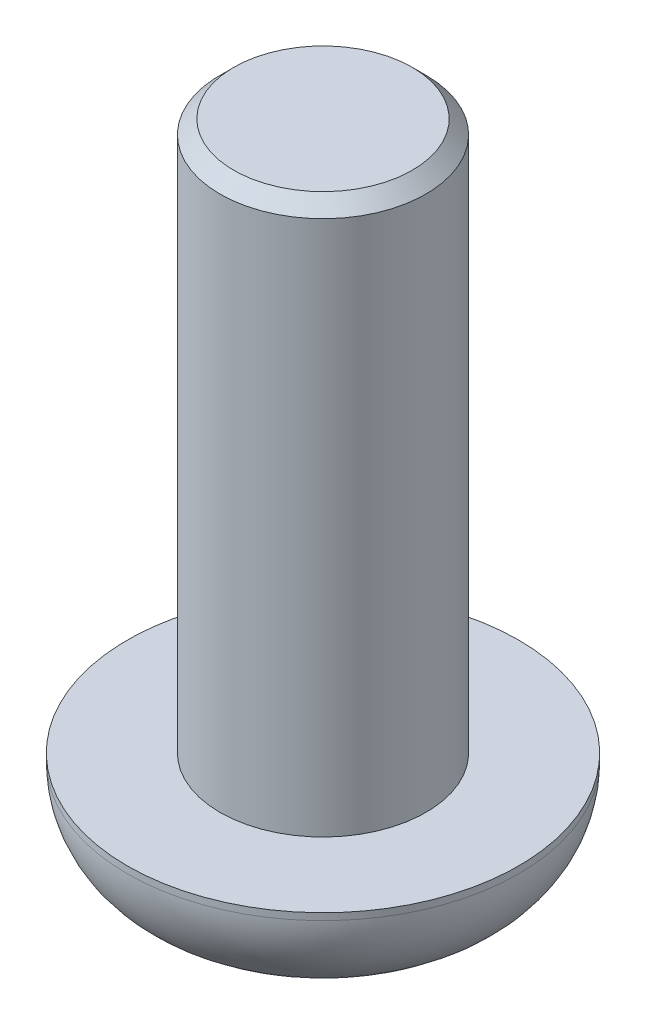
ISO-10303-21;
HEADER;
FILE_DESCRIPTION(('STEP AP214'),'2;1');
FILE_NAME('part.step','',(''),(''),'','','');
FILE_SCHEMA(('AUTOMOTIVE_DESIGN { 1 0 10303 214 1 1 1 1 }'));
ENDSEC;
DATA;
#1=APPLICATION_CONTEXT('core data for automotive mechanical design processes');
#2=APPLICATION_PROTOCOL_DEFINITION('international standard','automotive_design',2000,#1);
#3=PRODUCT_CONTEXT('',#1,'mechanical');
#4=PRODUCT('Part','Part','',(#3));
#5=PRODUCT_RELATED_PRODUCT_CATEGORY('part','',(#4));
#6=PRODUCT_DEFINITION_FORMATION('','',#4);
#7=PRODUCT_DEFINITION_CONTEXT('part definition',#1,'design');
#8=PRODUCT_DEFINITION('design','',#6,#7);
#9=PRODUCT_DEFINITION_SHAPE('','',#8);
#10=(LENGTH_UNIT() NAMED_UNIT(*) SI_UNIT(.MILLI.,.METRE.));
#11=(NAMED_UNIT(*) PLANE_ANGLE_UNIT() SI_UNIT($,.RADIAN.));
#12=(NAMED_UNIT(*) SI_UNIT($,.STERADIAN.) SOLID_ANGLE_UNIT());
#13=UNCERTAINTY_MEASURE_WITH_UNIT(LENGTH_MEASURE(1.E-05),#10,'distance_accuracy_value','');
#14=(GEOMETRIC_REPRESENTATION_CONTEXT(3) GLOBAL_UNCERTAINTY_ASSIGNED_CONTEXT((#13)) GLOBAL_UNIT_ASSIGNED_CONTEXT((#10,
#11,#12)) REPRESENTATION_CONTEXT('',''));
#15=CARTESIAN_POINT('',(0.,0.,0.));
#16=DIRECTION('',(0.,0.,1.));
#17=DIRECTION('',(1.,0.,0.));
#18=AXIS2_PLACEMENT_3D('',#15,#16,#17);
#19=CARTESIAN_POINT('',(218.851000000001,-269.,253.190000107156));
#20=DIRECTION('',(0.,-1.,0.));
#21=DIRECTION('',(0.,0.,-1.));
#22=AXIS2_PLACEMENT_3D('',#19,#20,#21);
#23=PLANE('',#22);
#24=DIRECTION('',(0.866025403784439,0.,-0.5));
#25=VECTOR('',#24,1.);
#26=CARTESIAN_POINT('',(219.851000000001,-269.,253.767350376345));
#27=LINE('',#26,#25);
#28=CARTESIAN_POINT('',(219.851000000001,-269.,253.767350376345));
#29=VERTEX_POINT('',#28);
#30=CARTESIAN_POINT('',(218.851000000001,-269.,254.344700645535));
#31=VERTEX_POINT('',#30);
#32=EDGE_CURVE('E85',#29,#31,#27,.F.);
#33=ORIENTED_EDGE('',*,*,#32,.T.);
#34=DIRECTION('',(0.866025403784439,0.,0.5));
#35=VECTOR('',#34,1.);
#36=CARTESIAN_POINT('',(218.851000000001,-269.,254.344700645535));
#37=LINE('',#36,#35);
#38=CARTESIAN_POINT('',(217.851,-269.,253.767350376345));
#39=VERTEX_POINT('',#38);
#40=EDGE_CURVE('E169',#31,#39,#37,.F.);
#41=ORIENTED_EDGE('',*,*,#40,.T.);
#42=DIRECTION('',(0.,0.,1.));
#43=VECTOR('',#42,1.);
#44=CARTESIAN_POINT('',(217.851,-269.,253.767350376345));
#45=LINE('',#44,#43);
#46=CARTESIAN_POINT('',(217.851,-269.,252.612649837966));
#47=VERTEX_POINT('',#46);
#48=EDGE_CURVE('E164',#39,#47,#45,.F.);
#49=ORIENTED_EDGE('',*,*,#48,.T.);
#50=DIRECTION('',(-0.866025403784438,0.,0.500000000000001));
#51=VECTOR('',#50,1.);
#52=CARTESIAN_POINT('',(217.851,-269.,252.612649837966));
#53=LINE('',#52,#51);
#54=CARTESIAN_POINT('',(218.851000000001,-269.,252.035299568776));
#55=VERTEX_POINT('',#54);
#56=EDGE_CURVE('E65',#47,#55,#53,.F.);
#57=ORIENTED_EDGE('',*,*,#56,.T.);
#58=DIRECTION('',(-0.866025403784439,0.,-0.499999999999999));
#59=VECTOR('',#58,1.);
#60=CARTESIAN_POINT('',(218.851000000001,-269.,252.035299568776));
#61=LINE('',#60,#59);
#62=CARTESIAN_POINT('',(219.851000000001,-269.,252.612649837966));
#63=VERTEX_POINT('',#62);
#64=EDGE_CURVE('E62',#55,#63,#61,.F.);
#65=ORIENTED_EDGE('',*,*,#64,.T.);
#66=DIRECTION('',(0.,0.,-1.));
#67=VECTOR('',#66,1.);
#68=CARTESIAN_POINT('',(219.851000000001,-269.,252.612649837966));
#69=LINE('',#68,#67);
#70=EDGE_CURVE('E59',#63,#29,#69,.F.);
#71=ORIENTED_EDGE('',*,*,#70,.T.);
#72=EDGE_LOOP('',(#33,#41,#49,#57,#65,#71));
#73=FACE_BOUND('',#72,.T.);
#74=ADVANCED_FACE('F16',(#73),#23,.T.);
#75=CARTESIAN_POINT('',(218.851000000001,-269.,252.035299568776));
#76=DIRECTION('',(0.499999999999999,0.,-0.866025403784439));
#77=DIRECTION('',(-0.866025403784439,0.,-0.499999999999999));
#78=AXIS2_PLACEMENT_3D('',#75,#76,#77);
#79=PLANE('',#78);
#80=DIRECTION('',(0.,1.,0.));
#81=VECTOR('',#80,1.);
#82=CARTESIAN_POINT('',(219.851000000001,-269.,252.612649837966));
#83=LINE('',#82,#81);
#84=CARTESIAN_POINT('',(219.851000000001,-270.5,252.612649837966));
#85=VERTEX_POINT('',#84);
#86=EDGE_CURVE('E69',#85,#63,#83,.T.);
#87=ORIENTED_EDGE('',*,*,#86,.T.);
#88=ORIENTED_EDGE('',*,*,#64,.F.);
#89=DIRECTION('',(0.,1.,0.));
#90=VECTOR('',#89,1.);
#91=CARTESIAN_POINT('',(218.851000000001,-269.,252.035299568776));
#92=LINE('',#91,#90);
#93=CARTESIAN_POINT('',(218.851000000001,-270.5,252.035299568776));
#94=VERTEX_POINT('',#93);
#95=EDGE_CURVE('E158',#55,#94,#92,.F.);
#96=ORIENTED_EDGE('',*,*,#95,.T.);
#97=DIRECTION('',(0.866025403784306,0.,0.50000000000023));
#98=VECTOR('',#97,1.);
#99=CARTESIAN_POINT('',(218.851000000001,-270.5,252.035299568776));
#100=LINE('',#99,#98);
#101=EDGE_CURVE('E75',#94,#85,#100,.T.);
#102=ORIENTED_EDGE('',*,*,#101,.T.);
#103=EDGE_LOOP('',(#87,#88,#96,#102));
#104=FACE_BOUND('',#103,.T.);
#105=ADVANCED_FACE('F73',(#104),#79,.F.);
#106=CARTESIAN_POINT('',(219.851000000001,-269.,252.612649837966));
#107=DIRECTION('',(1.,0.,0.));
#108=DIRECTION('',(0.,0.,-1.));
#109=AXIS2_PLACEMENT_3D('',#106,#107,#108);
#110=PLANE('',#109);
#111=DIRECTION('',(0.,1.,0.));
#112=VECTOR('',#111,1.);
#113=CARTESIAN_POINT('',(219.851000000001,-269.,253.767350376345));
#114=LINE('',#113,#112);
#115=CARTESIAN_POINT('',(219.851000000001,-270.5,253.767350376345));
#116=VERTEX_POINT('',#115);
#117=EDGE_CURVE('E82',#116,#29,#114,.T.);
#118=ORIENTED_EDGE('',*,*,#117,.T.);
#119=ORIENTED_EDGE('',*,*,#70,.F.);
#120=ORIENTED_EDGE('',*,*,#86,.F.);
#121=DIRECTION('',(0.,0.,1.));
#122=VECTOR('',#121,1.);
#123=CARTESIAN_POINT('',(219.851000000001,-270.5,253.190000107156));
#124=LINE('',#123,#122);
#125=EDGE_CURVE('E157',#85,#116,#124,.T.);
#126=ORIENTED_EDGE('',*,*,#125,.T.);
#127=EDGE_LOOP('',(#118,#119,#120,#126));
#128=FACE_BOUND('',#127,.T.);
#129=ADVANCED_FACE('F80',(#128),#110,.F.);
#130=CARTESIAN_POINT('',(219.851000000001,-269.,253.767350376345));
#131=DIRECTION('',(0.5,0.,0.866025403784439));
#132=DIRECTION('',(0.866025403784439,0.,-0.5));
#133=AXIS2_PLACEMENT_3D('',#130,#131,#132);
#134=PLANE('',#133);
#135=DIRECTION('',(0.,1.,0.));
#136=VECTOR('',#135,1.);
#137=CARTESIAN_POINT('',(218.851000000001,-269.,254.344700645535));
#138=LINE('',#137,#136);
#139=CARTESIAN_POINT('',(218.851000000001,-270.5,254.344700645535));
#140=VERTEX_POINT('',#139);
#141=EDGE_CURVE('E171',#140,#31,#138,.T.);
#142=ORIENTED_EDGE('',*,*,#141,.T.);
#143=ORIENTED_EDGE('',*,*,#32,.F.);
#144=ORIENTED_EDGE('',*,*,#117,.F.);
#145=DIRECTION('',(-0.866025403784306,0.,0.50000000000023));
#146=VECTOR('',#145,1.);
#147=CARTESIAN_POINT('',(219.851000000001,-270.5,253.767350376345));
#148=LINE('',#147,#146);
#149=EDGE_CURVE('E154',#116,#140,#148,.T.);
#150=ORIENTED_EDGE('',*,*,#149,.T.);
#151=EDGE_LOOP('',(#142,#143,#144,#150));
#152=FACE_BOUND('',#151,.T.);
#153=ADVANCED_FACE('F176',(#152),#134,.F.);
#154=CARTESIAN_POINT('',(218.851000000001,-269.,254.344700645535));
#155=DIRECTION('',(-0.5,0.,0.866025403784439));
#156=DIRECTION('',(0.866025403784439,0.,0.5));
#157=AXIS2_PLACEMENT_3D('',#154,#155,#156);
#158=PLANE('',#157);
#159=DIRECTION('',(0.,1.,0.));
#160=VECTOR('',#159,1.);
#161=CARTESIAN_POINT('',(217.851,-269.,253.767350376345));
#162=LINE('',#161,#160);
#163=CARTESIAN_POINT('',(217.851,-270.5,253.767350376345));
#164=VERTEX_POINT('',#163);
#165=EDGE_CURVE('E166',#164,#39,#162,.T.);
#166=ORIENTED_EDGE('',*,*,#165,.T.);
#167=ORIENTED_EDGE('',*,*,#40,.F.);
#168=ORIENTED_EDGE('',*,*,#141,.F.);
#169=DIRECTION('',(-0.866025403784516,0.,-0.499999999999866));
#170=VECTOR('',#169,1.);
#171=CARTESIAN_POINT('',(218.851000000001,-270.5,254.344700645535));
#172=LINE('',#171,#170);
#173=EDGE_CURVE('E146',#140,#164,#172,.T.);
#174=ORIENTED_EDGE('',*,*,#173,.T.);
#175=EDGE_LOOP('',(#166,#167,#168,#174));
#176=FACE_BOUND('',#175,.T.);
#177=ADVANCED_FACE('F181',(#176),#158,.F.);
#178=CARTESIAN_POINT('',(217.851,-269.,253.767350376345));
#179=DIRECTION('',(-1.,0.,0.));
#180=DIRECTION('',(0.,0.,1.));
#181=AXIS2_PLACEMENT_3D('',#178,#179,#180);
#182=PLANE('',#181);
#183=DIRECTION('',(0.,1.,0.));
#184=VECTOR('',#183,1.);
#185=CARTESIAN_POINT('',(217.851,-269.,252.612649837966));
#186=LINE('',#185,#184);
#187=CARTESIAN_POINT('',(217.851,-270.5,252.612649837966));
#188=VERTEX_POINT('',#187);
#189=EDGE_CURVE('E159',#188,#47,#186,.T.);
#190=ORIENTED_EDGE('',*,*,#189,.T.);
#191=ORIENTED_EDGE('',*,*,#48,.F.);
#192=ORIENTED_EDGE('',*,*,#165,.F.);
#193=DIRECTION('',(0.,0.,1.));
#194=VECTOR('',#193,1.);
#195=CARTESIAN_POINT('',(217.851,-270.5,253.190000107156));
#196=LINE('',#195,#194);
#197=EDGE_CURVE('E140',#164,#188,#196,.F.);
#198=ORIENTED_EDGE('',*,*,#197,.T.);
#199=EDGE_LOOP('',(#190,#191,#192,#198));
#200=FACE_BOUND('',#199,.T.);
#201=ADVANCED_FACE('F187',(#200),#182,.F.);
#202=CARTESIAN_POINT('',(217.851,-269.,252.612649837966));
#203=DIRECTION('',(-0.500000000000001,0.,-0.866025403784438));
#204=DIRECTION('',(-0.866025403784438,0.,0.500000000000001));
#205=AXIS2_PLACEMENT_3D('',#202,#203,#204);
#206=PLANE('',#205);
#207=ORIENTED_EDGE('',*,*,#95,.F.);
#208=ORIENTED_EDGE('',*,*,#56,.F.);
#209=ORIENTED_EDGE('',*,*,#189,.F.);
#210=DIRECTION('',(0.866025403784516,0.,-0.499999999999866));
#211=VECTOR('',#210,1.);
#212=CARTESIAN_POINT('',(217.851,-270.5,252.612649837966));
#213=LINE('',#212,#211);
#214=EDGE_CURVE('E138',#188,#94,#213,.T.);
#215=ORIENTED_EDGE('',*,*,#214,.T.);
#216=EDGE_LOOP('',(#207,#208,#209,#215));
#217=FACE_BOUND('',#216,.T.);
#218=ADVANCED_FACE('F188',(#217),#206,.F.);
#219=CARTESIAN_POINT('',(218.851000000001,-270.5,253.190000107156));
#220=DIRECTION('',(0.,1.,0.));
#221=DIRECTION('',(0.,0.,1.));
#222=AXIS2_PLACEMENT_3D('',#219,#220,#221);
#223=PLANE('',#222);
#224=ORIENTED_EDGE('',*,*,#197,.F.);
#225=ORIENTED_EDGE('',*,*,#173,.F.);
#226=ORIENTED_EDGE('',*,*,#149,.F.);
#227=ORIENTED_EDGE('',*,*,#125,.F.);
#228=ORIENTED_EDGE('',*,*,#101,.F.);
#229=ORIENTED_EDGE('',*,*,#214,.F.);
#230=EDGE_LOOP('',(#224,#225,#226,#227,#228,#229));
#231=FACE_BOUND('',#230,.T.);
#232=CARTESIAN_POINT('',(218.851000000001,-270.5,253.190000107156));
#233=DIRECTION('',(0.,1.,0.));
#234=DIRECTION('',(1.,0.,0.));
#235=AXIS2_PLACEMENT_3D('',#232,#233,#234);
#236=CIRCLE('',#235,1.44999999999901);
#237=CARTESIAN_POINT('',(220.301,-270.5,253.190000107156));
#238=VERTEX_POINT('',#237);
#239=CARTESIAN_POINT('',(217.401000000001,-270.5,253.190000107156));
#240=VERTEX_POINT('',#239);
#241=EDGE_CURVE('E33',#238,#240,#236,.T.);
#242=ORIENTED_EDGE('',*,*,#241,.F.);
#243=CARTESIAN_POINT('',(218.851000000001,-270.5,253.190000107156));
#244=DIRECTION('',(0.,1.,0.));
#245=DIRECTION('',(-1.,0.,0.));
#246=AXIS2_PLACEMENT_3D('',#243,#244,#245);
#247=CIRCLE('',#246,1.44999999999998);
#248=EDGE_CURVE('E102',#240,#238,#247,.T.);
#249=ORIENTED_EDGE('',*,*,#248,.F.);
#250=EDGE_LOOP('',(#242,#249));
#251=FACE_BOUND('',#250,.T.);
#252=ADVANCED_FACE('F115',(#231,#251),#223,.F.);
#253=CARTESIAN_POINT('',(218.851000000001,-269.1,253.190000107156));
#254=DIRECTION('',(0.,1.,0.));
#255=DIRECTION('',(1.,0.,0.));
#256=AXIS2_PLACEMENT_3D('',#253,#254,#255);
#257=TOROIDAL_SURFACE('',#256,1.45000000000001,1.4);
#258=ORIENTED_EDGE('',*,*,#241,.T.);
#259=ORIENTED_EDGE('',*,*,#248,.T.);
#260=EDGE_LOOP('',(#258,#259));
#261=FACE_BOUND('',#260,.T.);
#262=CARTESIAN_POINT('',(218.851000000001,-269.1,253.190000107156));
#263=DIRECTION('',(0.,1.,0.));
#264=DIRECTION('',(0.,0.,1.));
#265=AXIS2_PLACEMENT_3D('',#262,#263,#264);
#266=CIRCLE('',#265,2.85);
#267=CARTESIAN_POINT('',(218.851000000001,-269.1,256.040000107156));
#268=VERTEX_POINT('',#267);
#269=EDGE_CURVE('E95',#268,#268,#266,.T.);
#270=ORIENTED_EDGE('',*,*,#269,.F.);
#271=EDGE_LOOP('',(#270));
#272=FACE_BOUND('',#271,.T.);
#273=ADVANCED_FACE('F109',(#261,#272),#257,.T.);
#274=CARTESIAN_POINT('',(218.851000000001,-270.5,253.190000107156));
#275=DIRECTION('',(0.,1.,0.));
#276=DIRECTION('',(0.,0.,1.));
#277=AXIS2_PLACEMENT_3D('',#274,#275,#276);
#278=CYLINDRICAL_SURFACE('',#277,2.85);
#279=ORIENTED_EDGE('',*,*,#269,.T.);
#280=EDGE_LOOP('',(#279));
#281=FACE_BOUND('',#280,.T.);
#282=CARTESIAN_POINT('',(218.851000000001,-269.,253.190000107156));
#283=DIRECTION('',(0.,1.,0.));
#284=DIRECTION('',(0.,0.,1.));
#285=AXIS2_PLACEMENT_3D('',#282,#283,#284);
#286=CIRCLE('',#285,2.85);
#287=CARTESIAN_POINT('',(218.851000000001,-269.,256.040000107156));
#288=VERTEX_POINT('',#287);
#289=EDGE_CURVE('E19',#288,#288,#286,.T.);
#290=ORIENTED_EDGE('',*,*,#289,.F.);
#291=EDGE_LOOP('',(#290));
#292=FACE_BOUND('',#291,.T.);
#293=ADVANCED_FACE('F114',(#281,#292),#278,.T.);
#294=CARTESIAN_POINT('',(218.851000000001,-261.,253.190000107156));
#295=DIRECTION('',(0.,1.,0.));
#296=DIRECTION('',(0.,0.,1.));
#297=AXIS2_PLACEMENT_3D('',#294,#295,#296);
#298=PLANE('',#297);
#299=CARTESIAN_POINT('',(218.851000000001,-260.999999999995,253.190000107156));
#300=DIRECTION('',(0.,-1.,0.));
#301=DIRECTION('',(0.,0.,-1.));
#302=AXIS2_PLACEMENT_3D('',#299,#300,#301);
#303=CIRCLE('',#302,1.29999999990105);
#304=CARTESIAN_POINT('',(218.851000000001,-260.999999999995,251.890000107255));
#305=VERTEX_POINT('',#304);
#306=EDGE_CURVE('E90',#305,#305,#303,.T.);
#307=ORIENTED_EDGE('',*,*,#306,.F.);
#308=EDGE_LOOP('',(#307));
#309=FACE_BOUND('',#308,.T.);
#310=ADVANCED_FACE('F210',(#309),#298,.T.);
#311=CARTESIAN_POINT('',(218.851000000001,-269.,253.190000107156));
#312=DIRECTION('',(0.,1.,0.));
#313=DIRECTION('',(0.,0.,1.));
#314=AXIS2_PLACEMENT_3D('',#311,#312,#313);
#315=PLANE('',#314);
#316=CARTESIAN_POINT('',(218.851000000001,-269.,253.190000107156));
#317=DIRECTION('',(0.,-1.,0.));
#318=DIRECTION('',(0.,0.,-1.));
#319=AXIS2_PLACEMENT_3D('',#316,#317,#318);
#320=CIRCLE('',#319,1.5);
#321=CARTESIAN_POINT('',(218.851000000001,-269.,251.690000107156));
#322=VERTEX_POINT('',#321);
#323=EDGE_CURVE('E25',#322,#322,#320,.F.);
#324=ORIENTED_EDGE('',*,*,#323,.F.);
#325=EDGE_LOOP('',(#324));
#326=FACE_BOUND('',#325,.T.);
#327=ORIENTED_EDGE('',*,*,#289,.T.);
#328=EDGE_LOOP('',(#327));
#329=FACE_BOUND('',#328,.T.);
#330=ADVANCED_FACE('F205',(#326,#329),#315,.T.);
#331=CARTESIAN_POINT('',(218.851000000001,-261.200000000031,253.190000107156));
#332=DIRECTION('',(0.,-1.,0.));
#333=DIRECTION('',(0.,0.,-1.));
#334=AXIS2_PLACEMENT_3D('',#331,#332,#333);
#335=CONICAL_SURFACE('',#334,1.49999999999315,0.785398163539557);
#336=ORIENTED_EDGE('',*,*,#306,.T.);
#337=EDGE_LOOP('',(#336));
#338=FACE_BOUND('',#337,.T.);
#339=CARTESIAN_POINT('',(218.851000000001,-261.2,253.190000107156));
#340=DIRECTION('',(0.,-1.,0.));
#341=DIRECTION('',(0.,0.,-1.));
#342=AXIS2_PLACEMENT_3D('',#339,#340,#341);
#343=CIRCLE('',#342,1.5);
#344=CARTESIAN_POINT('',(218.851000000001,-261.2,251.690000107156));
#345=VERTEX_POINT('',#344);
#346=EDGE_CURVE('E11',#345,#345,#343,.T.);
#347=ORIENTED_EDGE('',*,*,#346,.F.);
#348=EDGE_LOOP('',(#347));
#349=FACE_BOUND('',#348,.T.);
#350=ADVANCED_FACE('F199',(#338,#349),#335,.T.);
#351=CARTESIAN_POINT('',(218.851000000001,-261.,253.190000107156));
#352=DIRECTION('',(0.,-1.,0.));
#353=DIRECTION('',(0.,0.,-1.));
#354=AXIS2_PLACEMENT_3D('',#351,#352,#353);
#355=CYLINDRICAL_SURFACE('',#354,1.5);
#356=ORIENTED_EDGE('',*,*,#346,.T.);
#357=EDGE_LOOP('',(#356));
#358=FACE_BOUND('',#357,.T.);
#359=ORIENTED_EDGE('',*,*,#323,.T.);
#360=EDGE_LOOP('',(#359));
#361=FACE_BOUND('',#360,.T.);
#362=ADVANCED_FACE('F197',(#358,#361),#355,.T.);
#363=CLOSED_SHELL('',(#74,#105,#129,#153,#177,#201,#218,#252,#273,#293,#310,#330,#350,#362));
#364=MANIFOLD_SOLID_BREP('B1',#363);
#365=ADVANCED_BREP_SHAPE_REPRESENTATION('',(#18,#364),#14);
#366=SHAPE_DEFINITION_REPRESENTATION(#9,#365);
ENDSEC;
END-ISO-10303-21;
